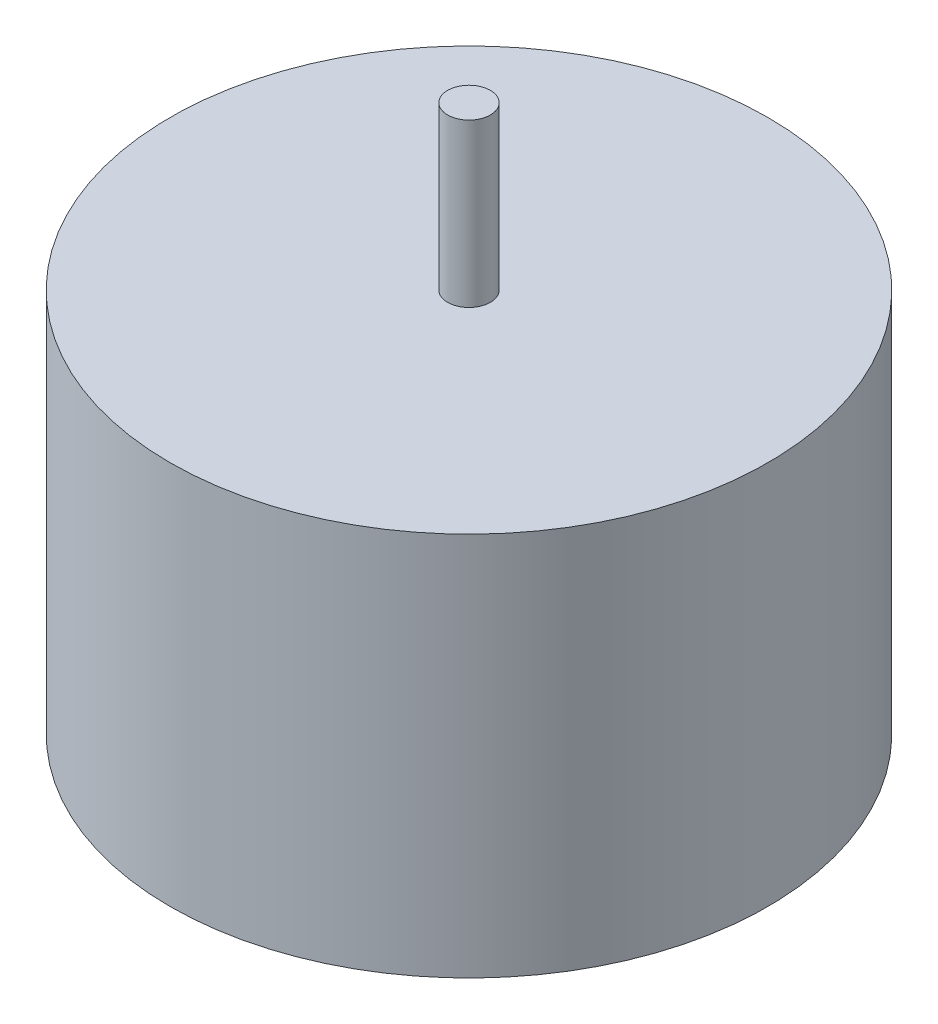
ISO-10303-21;
HEADER;
FILE_DESCRIPTION(('STEP AP214'),'2;1');
FILE_NAME('part.step','',(''),(''),'','','');
FILE_SCHEMA(('AUTOMOTIVE_DESIGN { 1 0 10303 214 1 1 1 1 }'));
ENDSEC;
DATA;
#1=APPLICATION_CONTEXT('core data for automotive mechanical design processes');
#2=APPLICATION_PROTOCOL_DEFINITION('international standard','automotive_design',2000,#1);
#3=PRODUCT_CONTEXT('',#1,'mechanical');
#4=PRODUCT('Part','Part','',(#3));
#5=PRODUCT_RELATED_PRODUCT_CATEGORY('part','',(#4));
#6=PRODUCT_DEFINITION_FORMATION('','',#4);
#7=PRODUCT_DEFINITION_CONTEXT('part definition',#1,'design');
#8=PRODUCT_DEFINITION('design','',#6,#7);
#9=PRODUCT_DEFINITION_SHAPE('','',#8);
#10=(LENGTH_UNIT() NAMED_UNIT(*) SI_UNIT(.MILLI.,.METRE.));
#11=(NAMED_UNIT(*) PLANE_ANGLE_UNIT() SI_UNIT($,.RADIAN.));
#12=(NAMED_UNIT(*) SI_UNIT($,.STERADIAN.) SOLID_ANGLE_UNIT());
#13=UNCERTAINTY_MEASURE_WITH_UNIT(LENGTH_MEASURE(1.E-05),#10,'distance_accuracy_value','');
#14=(GEOMETRIC_REPRESENTATION_CONTEXT(3) GLOBAL_UNCERTAINTY_ASSIGNED_CONTEXT((#13)) GLOBAL_UNIT_ASSIGNED_CONTEXT((#10,
#11,#12)) REPRESENTATION_CONTEXT('',''));
#15=CARTESIAN_POINT('',(0.,0.,0.));
#16=DIRECTION('',(0.,0.,1.));
#17=DIRECTION('',(1.,0.,0.));
#18=AXIS2_PLACEMENT_3D('',#15,#16,#17);
#19=CARTESIAN_POINT('',(0.,9.,0.));
#20=DIRECTION('',(0.,1.,0.));
#21=DIRECTION('',(0.,0.,1.));
#22=AXIS2_PLACEMENT_3D('',#19,#20,#21);
#23=PLANE('',#22);
#24=CARTESIAN_POINT('',(0.,9.,0.));
#25=DIRECTION('',(0.,1.,0.));
#26=DIRECTION('',(0.,0.,1.));
#27=AXIS2_PLACEMENT_3D('',#24,#25,#26);
#28=CIRCLE('',#27,7.);
#29=CARTESIAN_POINT('',(0.,9.,7.));
#30=VERTEX_POINT('',#29);
#31=EDGE_CURVE('E10',#30,#30,#28,.T.);
#32=ORIENTED_EDGE('',*,*,#31,.T.);
#33=EDGE_LOOP('',(#32));
#34=FACE_BOUND('',#33,.T.);
#35=CARTESIAN_POINT('',(0.,9.,0.));
#36=DIRECTION('',(0.,1.,0.));
#37=DIRECTION('',(0.,0.,1.));
#38=AXIS2_PLACEMENT_3D('',#35,#36,#37);
#39=CIRCLE('',#38,0.5);
#40=CARTESIAN_POINT('',(0.,9.,0.5));
#41=VERTEX_POINT('',#40);
#42=EDGE_CURVE('E69',#41,#41,#39,.T.);
#43=ORIENTED_EDGE('',*,*,#42,.F.);
#44=EDGE_LOOP('',(#43));
#45=FACE_BOUND('',#44,.T.);
#46=ADVANCED_FACE('F32',(#34,#45),#23,.T.);
#47=CARTESIAN_POINT('',(0.,9.,0.));
#48=DIRECTION('',(0.,-1.,0.));
#49=DIRECTION('',(0.,0.,-1.));
#50=AXIS2_PLACEMENT_3D('',#47,#48,#49);
#51=CYLINDRICAL_SURFACE('',#50,7.);
#52=ORIENTED_EDGE('',*,*,#31,.F.);
#53=EDGE_LOOP('',(#52));
#54=FACE_BOUND('',#53,.T.);
#55=CARTESIAN_POINT('',(0.,0.,0.));
#56=DIRECTION('',(0.,1.,0.));
#57=DIRECTION('',(0.,0.,1.));
#58=AXIS2_PLACEMENT_3D('',#55,#56,#57);
#59=CIRCLE('',#58,7.);
#60=CARTESIAN_POINT('',(0.,0.,7.));
#61=VERTEX_POINT('',#60);
#62=EDGE_CURVE('E36',#61,#61,#59,.T.);
#63=ORIENTED_EDGE('',*,*,#62,.T.);
#64=EDGE_LOOP('',(#63));
#65=FACE_BOUND('',#64,.T.);
#66=ADVANCED_FACE('F34',(#54,#65),#51,.T.);
#67=CARTESIAN_POINT('',(0.,0.,0.));
#68=DIRECTION('',(0.,1.,0.));
#69=DIRECTION('',(0.,0.,1.));
#70=AXIS2_PLACEMENT_3D('',#67,#68,#69);
#71=PLANE('',#70);
#72=CARTESIAN_POINT('',(-4.5,0.,0.));
#73=DIRECTION('',(0.,-1.,0.));
#74=DIRECTION('',(0.,0.,1.));
#75=AXIS2_PLACEMENT_3D('',#72,#73,#74);
#76=CIRCLE('',#75,1.);
#77=CARTESIAN_POINT('',(-4.5,0.,1.));
#78=VERTEX_POINT('',#77);
#79=EDGE_CURVE('E63',#78,#78,#76,.T.);
#80=ORIENTED_EDGE('',*,*,#79,.F.);
#81=EDGE_LOOP('',(#80));
#82=FACE_BOUND('',#81,.T.);
#83=CARTESIAN_POINT('',(0.,0.,-4.5));
#84=DIRECTION('',(0.,-1.,0.));
#85=DIRECTION('',(0.,0.,-1.));
#86=AXIS2_PLACEMENT_3D('',#83,#84,#85);
#87=CIRCLE('',#86,1.);
#88=CARTESIAN_POINT('',(0.,0.,-5.5));
#89=VERTEX_POINT('',#88);
#90=EDGE_CURVE('E57',#89,#89,#87,.T.);
#91=ORIENTED_EDGE('',*,*,#90,.F.);
#92=EDGE_LOOP('',(#91));
#93=FACE_BOUND('',#92,.T.);
#94=CARTESIAN_POINT('',(4.5,0.,0.));
#95=DIRECTION('',(0.,-1.,0.));
#96=DIRECTION('',(0.,0.,-1.));
#97=AXIS2_PLACEMENT_3D('',#94,#95,#96);
#98=CIRCLE('',#97,1.);
#99=CARTESIAN_POINT('',(4.5,0.,-1.));
#100=VERTEX_POINT('',#99);
#101=EDGE_CURVE('E51',#100,#100,#98,.T.);
#102=ORIENTED_EDGE('',*,*,#101,.F.);
#103=EDGE_LOOP('',(#102));
#104=FACE_BOUND('',#103,.T.);
#105=CARTESIAN_POINT('',(0.,0.,4.5));
#106=DIRECTION('',(0.,-1.,0.));
#107=DIRECTION('',(0.,0.,-1.));
#108=AXIS2_PLACEMENT_3D('',#105,#106,#107);
#109=CIRCLE('',#108,1.);
#110=CARTESIAN_POINT('',(0.,0.,3.5));
#111=VERTEX_POINT('',#110);
#112=EDGE_CURVE('E45',#111,#111,#109,.T.);
#113=ORIENTED_EDGE('',*,*,#112,.F.);
#114=EDGE_LOOP('',(#113));
#115=FACE_BOUND('',#114,.T.);
#116=ORIENTED_EDGE('',*,*,#62,.F.);
#117=EDGE_LOOP('',(#116));
#118=FACE_BOUND('',#117,.T.);
#119=ADVANCED_FACE('F89',(#82,#93,#104,#115,#118),#71,.F.);
#120=CARTESIAN_POINT('',(0.,2.5,4.5));
#121=DIRECTION('',(0.,-1.,0.));
#122=DIRECTION('',(0.,0.,-1.));
#123=AXIS2_PLACEMENT_3D('',#120,#121,#122);
#124=CYLINDRICAL_SURFACE('',#123,1.);
#125=CARTESIAN_POINT('',(0.,2.5,4.5));
#126=DIRECTION('',(0.,-1.,0.));
#127=DIRECTION('',(0.,0.,-1.));
#128=AXIS2_PLACEMENT_3D('',#125,#126,#127);
#129=CIRCLE('',#128,1.);
#130=CARTESIAN_POINT('',(0.,2.5,3.5));
#131=VERTEX_POINT('',#130);
#132=EDGE_CURVE('E43',#131,#131,#129,.T.);
#133=ORIENTED_EDGE('',*,*,#132,.F.);
#134=EDGE_LOOP('',(#133));
#135=FACE_BOUND('',#134,.T.);
#136=ORIENTED_EDGE('',*,*,#112,.T.);
#137=EDGE_LOOP('',(#136));
#138=FACE_BOUND('',#137,.T.);
#139=ADVANCED_FACE('F92',(#135,#138),#124,.F.);
#140=CARTESIAN_POINT('',(0.,2.5,4.5));
#141=DIRECTION('',(0.,-1.,0.));
#142=DIRECTION('',(0.,0.,-1.));
#143=AXIS2_PLACEMENT_3D('',#140,#141,#142);
#144=PLANE('',#143);
#145=ORIENTED_EDGE('',*,*,#132,.T.);
#146=EDGE_LOOP('',(#145));
#147=FACE_BOUND('',#146,.T.);
#148=ADVANCED_FACE('F99',(#147),#144,.T.);
#149=CARTESIAN_POINT('',(4.5,2.5,0.));
#150=DIRECTION('',(0.,-1.,0.));
#151=DIRECTION('',(0.,0.,-1.));
#152=AXIS2_PLACEMENT_3D('',#149,#150,#151);
#153=CYLINDRICAL_SURFACE('',#152,1.);
#154=CARTESIAN_POINT('',(4.5,2.5,0.));
#155=DIRECTION('',(0.,-1.,0.));
#156=DIRECTION('',(0.,0.,-1.));
#157=AXIS2_PLACEMENT_3D('',#154,#155,#156);
#158=CIRCLE('',#157,1.);
#159=CARTESIAN_POINT('',(4.5,2.5,-1.));
#160=VERTEX_POINT('',#159);
#161=EDGE_CURVE('E48',#160,#160,#158,.T.);
#162=ORIENTED_EDGE('',*,*,#161,.F.);
#163=EDGE_LOOP('',(#162));
#164=FACE_BOUND('',#163,.T.);
#165=ORIENTED_EDGE('',*,*,#101,.T.);
#166=EDGE_LOOP('',(#165));
#167=FACE_BOUND('',#166,.T.);
#168=ADVANCED_FACE('F113',(#164,#167),#153,.F.);
#169=CARTESIAN_POINT('',(4.5,2.5,0.));
#170=DIRECTION('',(0.,-1.,0.));
#171=DIRECTION('',(0.,0.,-1.));
#172=AXIS2_PLACEMENT_3D('',#169,#170,#171);
#173=PLANE('',#172);
#174=ORIENTED_EDGE('',*,*,#161,.T.);
#175=EDGE_LOOP('',(#174));
#176=FACE_BOUND('',#175,.T.);
#177=ADVANCED_FACE('F115',(#176),#173,.T.);
#178=CARTESIAN_POINT('',(0.,2.5,-4.5));
#179=DIRECTION('',(0.,-1.,0.));
#180=DIRECTION('',(0.,0.,-1.));
#181=AXIS2_PLACEMENT_3D('',#178,#179,#180);
#182=CYLINDRICAL_SURFACE('',#181,1.);
#183=CARTESIAN_POINT('',(0.,2.5,-4.5));
#184=DIRECTION('',(0.,-1.,0.));
#185=DIRECTION('',(0.,0.,-1.));
#186=AXIS2_PLACEMENT_3D('',#183,#184,#185);
#187=CIRCLE('',#186,1.);
#188=CARTESIAN_POINT('',(0.,2.5,-5.5));
#189=VERTEX_POINT('',#188);
#190=EDGE_CURVE('E54',#189,#189,#187,.T.);
#191=ORIENTED_EDGE('',*,*,#190,.F.);
#192=EDGE_LOOP('',(#191));
#193=FACE_BOUND('',#192,.T.);
#194=ORIENTED_EDGE('',*,*,#90,.T.);
#195=EDGE_LOOP('',(#194));
#196=FACE_BOUND('',#195,.T.);
#197=ADVANCED_FACE('F122',(#193,#196),#182,.F.);
#198=CARTESIAN_POINT('',(0.,2.5,-4.5));
#199=DIRECTION('',(0.,-1.,0.));
#200=DIRECTION('',(0.,0.,-1.));
#201=AXIS2_PLACEMENT_3D('',#198,#199,#200);
#202=PLANE('',#201);
#203=ORIENTED_EDGE('',*,*,#190,.T.);
#204=EDGE_LOOP('',(#203));
#205=FACE_BOUND('',#204,.T.);
#206=ADVANCED_FACE('F130',(#205),#202,.T.);
#207=CARTESIAN_POINT('',(-4.5,2.5,0.));
#208=DIRECTION('',(0.,-1.,0.));
#209=DIRECTION('',(0.,0.,-1.));
#210=AXIS2_PLACEMENT_3D('',#207,#208,#209);
#211=CYLINDRICAL_SURFACE('',#210,1.);
#212=CARTESIAN_POINT('',(-4.5,2.5,0.));
#213=DIRECTION('',(0.,-1.,0.));
#214=DIRECTION('',(0.,0.,1.));
#215=AXIS2_PLACEMENT_3D('',#212,#213,#214);
#216=CIRCLE('',#215,1.);
#217=CARTESIAN_POINT('',(-4.5,2.5,1.));
#218=VERTEX_POINT('',#217);
#219=EDGE_CURVE('E60',#218,#218,#216,.T.);
#220=ORIENTED_EDGE('',*,*,#219,.F.);
#221=EDGE_LOOP('',(#220));
#222=FACE_BOUND('',#221,.T.);
#223=ORIENTED_EDGE('',*,*,#79,.T.);
#224=EDGE_LOOP('',(#223));
#225=FACE_BOUND('',#224,.T.);
#226=ADVANCED_FACE('F134',(#222,#225),#211,.F.);
#227=CARTESIAN_POINT('',(-4.5,2.5,0.));
#228=DIRECTION('',(0.,1.,0.));
#229=DIRECTION('',(0.,0.,1.));
#230=AXIS2_PLACEMENT_3D('',#227,#228,#229);
#231=PLANE('',#230);
#232=ORIENTED_EDGE('',*,*,#219,.T.);
#233=EDGE_LOOP('',(#232));
#234=FACE_BOUND('',#233,.T.);
#235=ADVANCED_FACE('F80',(#234),#231,.F.);
#236=CARTESIAN_POINT('',(0.,12.8,0.));
#237=DIRECTION('',(0.,-1.,0.));
#238=DIRECTION('',(0.,0.,-1.));
#239=AXIS2_PLACEMENT_3D('',#236,#237,#238);
#240=CYLINDRICAL_SURFACE('',#239,0.5);
#241=CARTESIAN_POINT('',(0.,12.8,0.));
#242=DIRECTION('',(0.,1.,0.));
#243=DIRECTION('',(0.,0.,1.));
#244=AXIS2_PLACEMENT_3D('',#241,#242,#243);
#245=CIRCLE('',#244,0.5);
#246=CARTESIAN_POINT('',(0.,12.8,0.5));
#247=VERTEX_POINT('',#246);
#248=EDGE_CURVE('E66',#247,#247,#245,.T.);
#249=ORIENTED_EDGE('',*,*,#248,.F.);
#250=EDGE_LOOP('',(#249));
#251=FACE_BOUND('',#250,.T.);
#252=ORIENTED_EDGE('',*,*,#42,.T.);
#253=EDGE_LOOP('',(#252));
#254=FACE_BOUND('',#253,.T.);
#255=ADVANCED_FACE('F77',(#251,#254),#240,.T.);
#256=CARTESIAN_POINT('',(0.,12.8,0.));
#257=DIRECTION('',(0.,1.,0.));
#258=DIRECTION('',(0.,0.,1.));
#259=AXIS2_PLACEMENT_3D('',#256,#257,#258);
#260=PLANE('',#259);
#261=ORIENTED_EDGE('',*,*,#248,.T.);
#262=EDGE_LOOP('',(#261));
#263=FACE_BOUND('',#262,.T.);
#264=ADVANCED_FACE('F75',(#263),#260,.T.);
#265=CLOSED_SHELL('',(#46,#66,#119,#139,#148,#168,#177,#197,#206,#226,#235,#255,#264));
#266=MANIFOLD_SOLID_BREP('B2',#265);
#267=ADVANCED_BREP_SHAPE_REPRESENTATION('',(#18,#266),#14);
#268=SHAPE_DEFINITION_REPRESENTATION(#9,#267);
ENDSEC;
END-ISO-10303-21;
